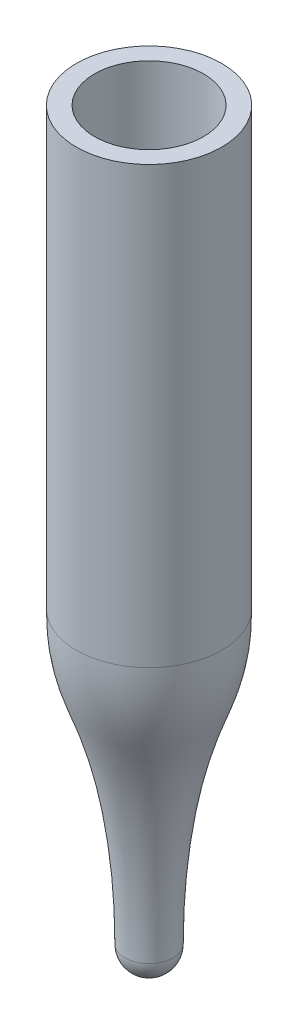
ISO-10303-21;
HEADER;
FILE_DESCRIPTION(('STEP AP214'),'2;1');
FILE_NAME('part.step','',(''),(''),'','','');
FILE_SCHEMA(('AUTOMOTIVE_DESIGN { 1 0 10303 214 1 1 1 1 }'));
ENDSEC;
DATA;
#1=APPLICATION_CONTEXT('core data for automotive mechanical design processes');
#2=APPLICATION_PROTOCOL_DEFINITION('international standard','automotive_design',2000,#1);
#3=PRODUCT_CONTEXT('',#1,'mechanical');
#4=PRODUCT('Part','Part','',(#3));
#5=PRODUCT_RELATED_PRODUCT_CATEGORY('part','',(#4));
#6=PRODUCT_DEFINITION_FORMATION('','',#4);
#7=PRODUCT_DEFINITION_CONTEXT('part definition',#1,'design');
#8=PRODUCT_DEFINITION('design','',#6,#7);
#9=PRODUCT_DEFINITION_SHAPE('','',#8);
#10=(LENGTH_UNIT() NAMED_UNIT(*) SI_UNIT(.MILLI.,.METRE.));
#11=(NAMED_UNIT(*) PLANE_ANGLE_UNIT() SI_UNIT($,.RADIAN.));
#12=(NAMED_UNIT(*) SI_UNIT($,.STERADIAN.) SOLID_ANGLE_UNIT());
#13=UNCERTAINTY_MEASURE_WITH_UNIT(LENGTH_MEASURE(1.E-05),#10,'distance_accuracy_value','');
#14=(GEOMETRIC_REPRESENTATION_CONTEXT(3) GLOBAL_UNCERTAINTY_ASSIGNED_CONTEXT((#13)) GLOBAL_UNIT_ASSIGNED_CONTEXT((#10,
#11,#12)) REPRESENTATION_CONTEXT('',''));
#15=CARTESIAN_POINT('',(0.,0.,0.));
#16=DIRECTION('',(0.,0.,1.));
#17=DIRECTION('',(1.,0.,0.));
#18=AXIS2_PLACEMENT_3D('',#15,#16,#17);
#19=CARTESIAN_POINT('',(0.,1.,0.));
#20=DIRECTION('',(0.,-1.,0.));
#21=DIRECTION('',(-1.,0.,0.));
#22=AXIS2_PLACEMENT_3D('',#19,#20,#21);
#23=SPHERICAL_SURFACE('',#22,1.);
#24=CARTESIAN_POINT('',(0.,0.999999999999987,0.));
#25=DIRECTION('',(0.,-1.,0.));
#26=DIRECTION('',(0.,0.,-1.));
#27=AXIS2_PLACEMENT_3D('',#24,#25,#26);
#28=CIRCLE('',#27,1.);
#29=CARTESIAN_POINT('',(0.,0.999999999999987,-1.));
#30=VERTEX_POINT('',#29);
#31=EDGE_CURVE('E10',#30,#30,#28,.T.);
#32=ORIENTED_EDGE('',*,*,#31,.T.);
#33=EDGE_LOOP('',(#32));
#34=FACE_BOUND('',#33,.T.);
#35=ADVANCED_FACE('F35',(#34),#23,.T.);
#36=CARTESIAN_POINT('',(1.,0.999999999999987,0.));
#37=CARTESIAN_POINT('',(0.999999999999985,4.31264817270921,0.));
#38=CARTESIAN_POINT('',(1.9097408750893,9.13900526062023,0.));
#39=CARTESIAN_POINT('',(3.,10.8287582656647,0.));
#40=CARTESIAN_POINT('',(3.,13.,0.));
#41=B_SPLINE_CURVE_WITH_KNOTS('',3,(#36,#37,#38,#39,#40),.UNSPECIFIED.,.F.,.F.,(4,1,4),(0.,
0.522519010299687,1.),.UNSPECIFIED.);
#42=CARTESIAN_POINT('',(0.,0.,0.));
#43=DIRECTION('',(0.,-1.,0.));
#44=AXIS1_PLACEMENT('',#42,#43);
#45=SURFACE_OF_REVOLUTION('',#41,#44);
#46=CARTESIAN_POINT('',(0.,13.,0.));
#47=DIRECTION('',(0.,-1.,0.));
#48=DIRECTION('',(0.,0.,-1.));
#49=AXIS2_PLACEMENT_3D('',#46,#47,#48);
#50=CIRCLE('',#49,3.);
#51=CARTESIAN_POINT('',(0.,13.,-3.));
#52=VERTEX_POINT('',#51);
#53=EDGE_CURVE('E41',#52,#52,#50,.T.);
#54=ORIENTED_EDGE('',*,*,#53,.T.);
#55=EDGE_LOOP('',(#54));
#56=FACE_BOUND('',#55,.T.);
#57=ORIENTED_EDGE('',*,*,#31,.F.);
#58=EDGE_LOOP('',(#57));
#59=FACE_BOUND('',#58,.T.);
#60=ADVANCED_FACE('F87',(#56,#59),#45,.F.);
#61=CARTESIAN_POINT('',(0.,0.,0.));
#62=DIRECTION('',(0.,-1.,0.));
#63=DIRECTION('',(0.,0.,-1.));
#64=AXIS2_PLACEMENT_3D('',#61,#62,#63);
#65=CYLINDRICAL_SURFACE('',#64,3.);
#66=CARTESIAN_POINT('',(0.,31.,0.));
#67=DIRECTION('',(0.,-1.,0.));
#68=DIRECTION('',(0.,0.,-1.));
#69=AXIS2_PLACEMENT_3D('',#66,#67,#68);
#70=CIRCLE('',#69,3.);
#71=CARTESIAN_POINT('',(0.,31.,-3.));
#72=VERTEX_POINT('',#71);
#73=EDGE_CURVE('E45',#72,#72,#70,.T.);
#74=ORIENTED_EDGE('',*,*,#73,.T.);
#75=EDGE_LOOP('',(#74));
#76=FACE_BOUND('',#75,.T.);
#77=ORIENTED_EDGE('',*,*,#53,.F.);
#78=EDGE_LOOP('',(#77));
#79=FACE_BOUND('',#78,.T.);
#80=ADVANCED_FACE('F84',(#76,#79),#65,.T.);
#81=CARTESIAN_POINT('',(2.25,31.,0.));
#82=DIRECTION('',(0.,1.,0.));
#83=DIRECTION('',(0.,0.,1.));
#84=AXIS2_PLACEMENT_3D('',#81,#82,#83);
#85=PLANE('',#84);
#86=CARTESIAN_POINT('',(0.,31.,0.));
#87=DIRECTION('',(0.,-1.,0.));
#88=DIRECTION('',(0.,0.,-1.));
#89=AXIS2_PLACEMENT_3D('',#86,#87,#88);
#90=CIRCLE('',#89,2.25);
#91=CARTESIAN_POINT('',(0.,31.,-2.25));
#92=VERTEX_POINT('',#91);
#93=EDGE_CURVE('E49',#92,#92,#90,.T.);
#94=ORIENTED_EDGE('',*,*,#93,.T.);
#95=EDGE_LOOP('',(#94));
#96=FACE_BOUND('',#95,.T.);
#97=ORIENTED_EDGE('',*,*,#73,.F.);
#98=EDGE_LOOP('',(#97));
#99=FACE_BOUND('',#98,.T.);
#100=ADVANCED_FACE('F80',(#96,#99),#85,.T.);
#101=CARTESIAN_POINT('',(0.,0.,0.));
#102=DIRECTION('',(0.,-1.,0.));
#103=DIRECTION('',(0.,0.,-1.));
#104=AXIS2_PLACEMENT_3D('',#101,#102,#103);
#105=CYLINDRICAL_SURFACE('',#104,2.25);
#106=CARTESIAN_POINT('',(0.,13.,0.));
#107=DIRECTION('',(0.,-1.,0.));
#108=DIRECTION('',(0.,0.,-1.));
#109=AXIS2_PLACEMENT_3D('',#106,#107,#108);
#110=CIRCLE('',#109,2.25);
#111=CARTESIAN_POINT('',(0.,13.,-2.25));
#112=VERTEX_POINT('',#111);
#113=EDGE_CURVE('E54',#112,#112,#110,.T.);
#114=ORIENTED_EDGE('',*,*,#113,.T.);
#115=EDGE_LOOP('',(#114));
#116=FACE_BOUND('',#115,.T.);
#117=ORIENTED_EDGE('',*,*,#93,.F.);
#118=EDGE_LOOP('',(#117));
#119=FACE_BOUND('',#118,.T.);
#120=ADVANCED_FACE('F76',(#116,#119),#105,.F.);
#121=CARTESIAN_POINT('',(2.25,13.,0.));
#122=CARTESIAN_POINT('',(2.25,12.8717371958395,0.));
#123=CARTESIAN_POINT('',(2.24578757403253,12.606951451986,0.));
#124=CARTESIAN_POINT('',(2.22203895467567,12.1438514293347,0.));
#125=CARTESIAN_POINT('',(2.1665200763649,11.6319170952115,0.));
#126=CARTESIAN_POINT('',(2.06648337846505,11.1056390104059,0.));
#127=CARTESIAN_POINT('',(1.89545956631693,10.4656430659313,0.));
#128=CARTESIAN_POINT('',(1.61444987114057,9.69139574120363,0.));
#129=CARTESIAN_POINT('',(1.20882322411167,8.54637983033185,0.));
#130=CARTESIAN_POINT('',(0.833436633455366,7.09066214365265,0.));
#131=CARTESIAN_POINT('',(0.520883429290419,5.35716043219397,0.));
#132=CARTESIAN_POINT('',(0.341470293435962,3.67186045070724,0.));
#133=CARTESIAN_POINT('',(0.263896436009576,2.19698492585518,0.));
#134=CARTESIAN_POINT('',(0.249999999999998,1.39355256995701,0.));
#135=CARTESIAN_POINT('',(0.25,0.999999999999984,0.));
#136=B_SPLINE_CURVE_WITH_KNOTS('',3,(#121,#122,#123,#124,#125,#126,#127,#128,#129,#130,#131,
#132,#133,#134,#135),.UNSPECIFIED.,.F.,.F.,(4,1,1,1,1,1,1,1,1,1,1,1,4),(0.,0.03125,0.0625,0.125,
0.1875,0.25,0.375,0.5,0.625,0.75,0.875,0.9375,1.),.UNSPECIFIED.);
#137=CARTESIAN_POINT('',(0.,0.,0.));
#138=DIRECTION('',(0.,-1.,0.));
#139=AXIS1_PLACEMENT('',#137,#138);
#140=SURFACE_OF_REVOLUTION('',#136,#139);
#141=CARTESIAN_POINT('',(0.,1.,0.));
#142=DIRECTION('',(0.,-1.,0.));
#143=DIRECTION('',(0.,0.,-1.));
#144=AXIS2_PLACEMENT_3D('',#141,#142,#143);
#145=CIRCLE('',#144,0.25);
#146=CARTESIAN_POINT('',(0.,1.,-0.25));
#147=VERTEX_POINT('',#146);
#148=EDGE_CURVE('E57',#147,#147,#145,.T.);
#149=ORIENTED_EDGE('',*,*,#148,.T.);
#150=EDGE_LOOP('',(#149));
#151=FACE_BOUND('',#150,.T.);
#152=ORIENTED_EDGE('',*,*,#113,.F.);
#153=EDGE_LOOP('',(#152));
#154=FACE_BOUND('',#153,.T.);
#155=ADVANCED_FACE('F71',(#151,#154),#140,.F.);
#156=CARTESIAN_POINT('',(0.,1.,0.));
#157=DIRECTION('',(0.,-1.,0.));
#158=DIRECTION('',(1.,0.,0.));
#159=AXIS2_PLACEMENT_3D('',#156,#157,#158);
#160=SPHERICAL_SURFACE('',#159,0.25);
#161=ORIENTED_EDGE('',*,*,#148,.F.);
#162=EDGE_LOOP('',(#161));
#163=FACE_BOUND('',#162,.T.);
#164=ADVANCED_FACE('F75',(#163),#160,.F.);
#165=CLOSED_SHELL('',(#35,#60,#80,#100,#120,#155,#164));
#166=MANIFOLD_SOLID_BREP('B2',#165);
#167=ADVANCED_BREP_SHAPE_REPRESENTATION('',(#18,#166),#14);
#168=SHAPE_DEFINITION_REPRESENTATION(#9,#167);
ENDSEC;
END-ISO-10303-21;
